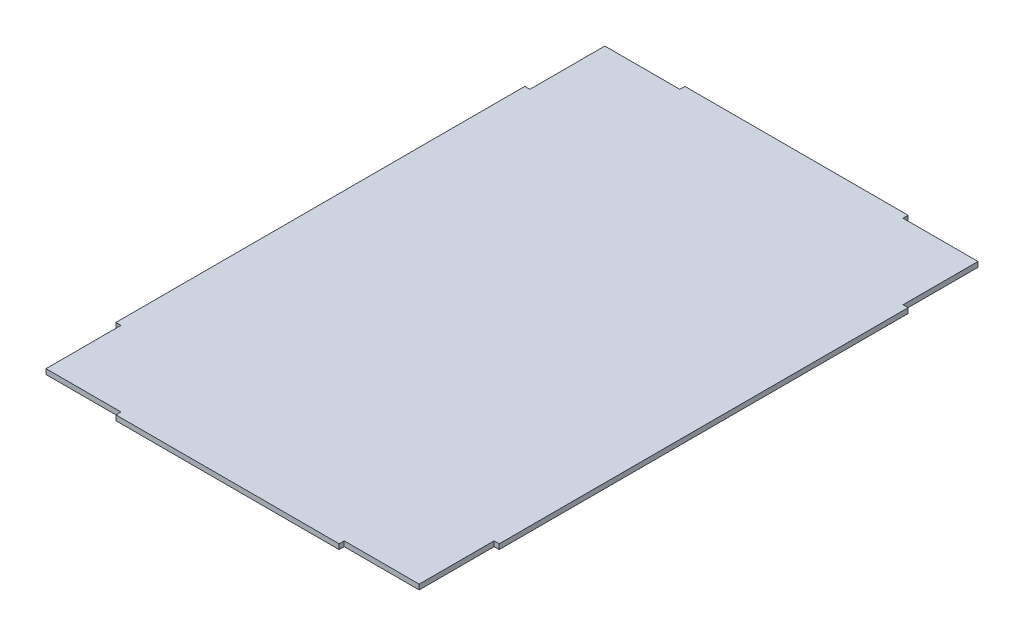
ISO-10303-21;
HEADER;
FILE_DESCRIPTION(('STEP AP214'),'2;1');
FILE_NAME('part.step','',(''),(''),'','','');
FILE_SCHEMA(('AUTOMOTIVE_DESIGN { 1 0 10303 214 1 1 1 1 }'));
ENDSEC;
DATA;
#1=APPLICATION_CONTEXT('core data for automotive mechanical design processes');
#2=APPLICATION_PROTOCOL_DEFINITION('international standard','automotive_design',2000,#1);
#3=PRODUCT_CONTEXT('',#1,'mechanical');
#4=PRODUCT('Part','Part','',(#3));
#5=PRODUCT_RELATED_PRODUCT_CATEGORY('part','',(#4));
#6=PRODUCT_DEFINITION_FORMATION('','',#4);
#7=PRODUCT_DEFINITION_CONTEXT('part definition',#1,'design');
#8=PRODUCT_DEFINITION('design','',#6,#7);
#9=PRODUCT_DEFINITION_SHAPE('','',#8);
#10=(LENGTH_UNIT() NAMED_UNIT(*) SI_UNIT(.MILLI.,.METRE.));
#11=(NAMED_UNIT(*) PLANE_ANGLE_UNIT() SI_UNIT($,.RADIAN.));
#12=(NAMED_UNIT(*) SI_UNIT($,.STERADIAN.) SOLID_ANGLE_UNIT());
#13=UNCERTAINTY_MEASURE_WITH_UNIT(LENGTH_MEASURE(1.E-05),#10,'distance_accuracy_value','');
#14=(GEOMETRIC_REPRESENTATION_CONTEXT(3) GLOBAL_UNCERTAINTY_ASSIGNED_CONTEXT((#13)) GLOBAL_UNIT_ASSIGNED_CONTEXT((#10,
#11,#12)) REPRESENTATION_CONTEXT('',''));
#15=CARTESIAN_POINT('',(0.,0.,0.));
#16=DIRECTION('',(0.,0.,1.));
#17=DIRECTION('',(1.,0.,0.));
#18=AXIS2_PLACEMENT_3D('',#15,#16,#17);
#19=CARTESIAN_POINT('',(239.5,3.175,355.5));
#20=DIRECTION('',(-1.,0.,0.));
#21=DIRECTION('',(0.,0.,1.));
#22=AXIS2_PLACEMENT_3D('',#19,#20,#21);
#23=PLANE('',#22);
#24=DIRECTION('',(0.,0.,-1.));
#25=VECTOR('',#24,1.);
#26=CARTESIAN_POINT('',(239.5,3.175,355.5));
#27=LINE('',#26,#25);
#28=CARTESIAN_POINT('',(239.5,3.175,255.5));
#29=VERTEX_POINT('',#28);
#30=CARTESIAN_POINT('',(239.5,3.175,-255.5));
#31=VERTEX_POINT('',#30);
#32=EDGE_CURVE('E225',#29,#31,#27,.T.);
#33=ORIENTED_EDGE('',*,*,#32,.F.);
#34=DIRECTION('',(0.,1.,0.));
#35=VECTOR('',#34,1.);
#36=CARTESIAN_POINT('',(239.5,-3.175,255.5));
#37=LINE('',#36,#35);
#38=CARTESIAN_POINT('',(239.5,-3.175,255.5));
#39=VERTEX_POINT('',#38);
#40=EDGE_CURVE('E317',#39,#29,#37,.T.);
#41=ORIENTED_EDGE('',*,*,#40,.F.);
#42=DIRECTION('',(0.,0.,-1.));
#43=VECTOR('',#42,1.);
#44=CARTESIAN_POINT('',(239.5,-3.175,355.5));
#45=LINE('',#44,#43);
#46=CARTESIAN_POINT('',(239.5,-3.175,-255.5));
#47=VERTEX_POINT('',#46);
#48=EDGE_CURVE('E211',#39,#47,#45,.T.);
#49=ORIENTED_EDGE('',*,*,#48,.T.);
#50=DIRECTION('',(0.,1.,0.));
#51=VECTOR('',#50,1.);
#52=CARTESIAN_POINT('',(239.5,-3.175,-255.5));
#53=LINE('',#52,#51);
#54=EDGE_CURVE('E259',#47,#31,#53,.T.);
#55=ORIENTED_EDGE('',*,*,#54,.T.);
#56=EDGE_LOOP('',(#33,#41,#49,#55));
#57=FACE_BOUND('',#56,.T.);
#58=ADVANCED_FACE('F39',(#57),#23,.F.);
#59=CARTESIAN_POINT('',(-239.5,3.175,-355.5));
#60=DIRECTION('',(0.,0.,1.));
#61=DIRECTION('',(1.,0.,0.));
#62=AXIS2_PLACEMENT_3D('',#59,#60,#61);
#63=PLANE('',#62);
#64=DIRECTION('',(-1.,0.,0.));
#65=VECTOR('',#64,1.);
#66=CARTESIAN_POINT('',(-239.5,3.175,-355.5));
#67=LINE('',#66,#65);
#68=CARTESIAN_POINT('',(139.5,3.175,-355.5));
#69=VERTEX_POINT('',#68);
#70=CARTESIAN_POINT('',(-139.5,3.175,-355.5));
#71=VERTEX_POINT('',#70);
#72=EDGE_CURVE('E199',#69,#71,#67,.T.);
#73=ORIENTED_EDGE('',*,*,#72,.F.);
#74=DIRECTION('',(0.,1.,0.));
#75=VECTOR('',#74,1.);
#76=CARTESIAN_POINT('',(139.5,-3.175,-355.5));
#77=LINE('',#76,#75);
#78=CARTESIAN_POINT('',(139.5,-3.175,-355.5));
#79=VERTEX_POINT('',#78);
#80=EDGE_CURVE('E182',#79,#69,#77,.T.);
#81=ORIENTED_EDGE('',*,*,#80,.F.);
#82=DIRECTION('',(-1.,0.,0.));
#83=VECTOR('',#82,1.);
#84=CARTESIAN_POINT('',(-239.5,-3.175,-355.5));
#85=LINE('',#84,#83);
#86=CARTESIAN_POINT('',(-139.5,-3.175,-355.5));
#87=VERTEX_POINT('',#86);
#88=EDGE_CURVE('E197',#79,#87,#85,.T.);
#89=ORIENTED_EDGE('',*,*,#88,.T.);
#90=DIRECTION('',(0.,1.,0.));
#91=VECTOR('',#90,1.);
#92=CARTESIAN_POINT('',(-139.5,-3.175,-355.5));
#93=LINE('',#92,#91);
#94=EDGE_CURVE('E217',#87,#71,#93,.T.);
#95=ORIENTED_EDGE('',*,*,#94,.T.);
#96=EDGE_LOOP('',(#73,#81,#89,#95));
#97=FACE_BOUND('',#96,.T.);
#98=ADVANCED_FACE('F195',(#97),#63,.F.);
#99=CARTESIAN_POINT('',(-239.5,3.175,355.5));
#100=DIRECTION('',(1.,0.,0.));
#101=DIRECTION('',(0.,0.,-1.));
#102=AXIS2_PLACEMENT_3D('',#99,#100,#101);
#103=PLANE('',#102);
#104=DIRECTION('',(0.,0.,1.));
#105=VECTOR('',#104,1.);
#106=CARTESIAN_POINT('',(-239.5,-3.175,355.5));
#107=LINE('',#106,#105);
#108=CARTESIAN_POINT('',(-239.5,-3.175,-255.5));
#109=VERTEX_POINT('',#108);
#110=CARTESIAN_POINT('',(-239.5,-3.175,255.5));
#111=VERTEX_POINT('',#110);
#112=EDGE_CURVE('E210',#109,#111,#107,.T.);
#113=ORIENTED_EDGE('',*,*,#112,.T.);
#114=DIRECTION('',(0.,1.,0.));
#115=VECTOR('',#114,1.);
#116=CARTESIAN_POINT('',(-239.5,-3.175,255.5));
#117=LINE('',#116,#115);
#118=CARTESIAN_POINT('',(-239.5,3.175,255.5));
#119=VERTEX_POINT('',#118);
#120=EDGE_CURVE('E285',#111,#119,#117,.T.);
#121=ORIENTED_EDGE('',*,*,#120,.T.);
#122=DIRECTION('',(0.,0.,1.));
#123=VECTOR('',#122,1.);
#124=CARTESIAN_POINT('',(-239.5,3.175,355.5));
#125=LINE('',#124,#123);
#126=CARTESIAN_POINT('',(-239.5,3.175,-255.5));
#127=VERTEX_POINT('',#126);
#128=EDGE_CURVE('E48',#127,#119,#125,.T.);
#129=ORIENTED_EDGE('',*,*,#128,.F.);
#130=DIRECTION('',(0.,1.,0.));
#131=VECTOR('',#130,1.);
#132=CARTESIAN_POINT('',(-239.5,-3.175,-255.5));
#133=LINE('',#132,#131);
#134=EDGE_CURVE('E229',#109,#127,#133,.T.);
#135=ORIENTED_EDGE('',*,*,#134,.F.);
#136=EDGE_LOOP('',(#113,#121,#129,#135));
#137=FACE_BOUND('',#136,.T.);
#138=ADVANCED_FACE('F445',(#137),#103,.F.);
#139=CARTESIAN_POINT('',(-239.5,3.175,355.5));
#140=DIRECTION('',(0.,0.,-1.));
#141=DIRECTION('',(-1.,0.,0.));
#142=AXIS2_PLACEMENT_3D('',#139,#140,#141);
#143=PLANE('',#142);
#144=DIRECTION('',(1.,0.,0.));
#145=VECTOR('',#144,1.);
#146=CARTESIAN_POINT('',(-239.5,3.175,355.5));
#147=LINE('',#146,#145);
#148=CARTESIAN_POINT('',(-139.5,3.175,355.5));
#149=VERTEX_POINT('',#148);
#150=CARTESIAN_POINT('',(139.5,3.175,355.5));
#151=VERTEX_POINT('',#150);
#152=EDGE_CURVE('E11',#149,#151,#147,.T.);
#153=ORIENTED_EDGE('',*,*,#152,.F.);
#154=DIRECTION('',(0.,1.,0.));
#155=VECTOR('',#154,1.);
#156=CARTESIAN_POINT('',(-139.5,-3.175,355.5));
#157=LINE('',#156,#155);
#158=CARTESIAN_POINT('',(-139.5,-3.175,355.5));
#159=VERTEX_POINT('',#158);
#160=EDGE_CURVE('E272',#159,#149,#157,.T.);
#161=ORIENTED_EDGE('',*,*,#160,.F.);
#162=DIRECTION('',(1.,0.,0.));
#163=VECTOR('',#162,1.);
#164=CARTESIAN_POINT('',(-239.5,-3.175,355.5));
#165=LINE('',#164,#163);
#166=CARTESIAN_POINT('',(139.5,-3.175,355.5));
#167=VERTEX_POINT('',#166);
#168=EDGE_CURVE('E42',#159,#167,#165,.T.);
#169=ORIENTED_EDGE('',*,*,#168,.T.);
#170=DIRECTION('',(0.,1.,0.));
#171=VECTOR('',#170,1.);
#172=CARTESIAN_POINT('',(139.5,-3.175,355.5));
#173=LINE('',#172,#171);
#174=EDGE_CURVE('E330',#167,#151,#173,.T.);
#175=ORIENTED_EDGE('',*,*,#174,.T.);
#176=EDGE_LOOP('',(#153,#161,#169,#175));
#177=FACE_BOUND('',#176,.T.);
#178=ADVANCED_FACE('F427',(#177),#143,.F.);
#179=CARTESIAN_POINT('',(0.,3.175,0.));
#180=DIRECTION('',(0.,-1.,0.));
#181=DIRECTION('',(0.,0.,-1.));
#182=AXIS2_PLACEMENT_3D('',#179,#180,#181);
#183=PLANE('',#182);
#184=ORIENTED_EDGE('',*,*,#128,.T.);
#185=DIRECTION('',(-1.,0.,0.));
#186=VECTOR('',#185,1.);
#187=CARTESIAN_POINT('',(-233.15,3.175,255.5));
#188=LINE('',#187,#186);
#189=CARTESIAN_POINT('',(-233.15,3.175,255.5));
#190=VERTEX_POINT('',#189);
#191=EDGE_CURVE('E290',#190,#119,#188,.T.);
#192=ORIENTED_EDGE('',*,*,#191,.F.);
#193=DIRECTION('',(0.,0.,-1.));
#194=VECTOR('',#193,1.);
#195=CARTESIAN_POINT('',(-233.15,3.175,349.15));
#196=LINE('',#195,#194);
#197=CARTESIAN_POINT('',(-233.15,3.175,349.15));
#198=VERTEX_POINT('',#197);
#199=EDGE_CURVE('E294',#198,#190,#196,.T.);
#200=ORIENTED_EDGE('',*,*,#199,.F.);
#201=DIRECTION('',(-1.,0.,0.));
#202=VECTOR('',#201,1.);
#203=CARTESIAN_POINT('',(-139.5,3.175,349.15));
#204=LINE('',#203,#202);
#205=CARTESIAN_POINT('',(-139.5,3.175,349.15));
#206=VERTEX_POINT('',#205);
#207=EDGE_CURVE('E298',#206,#198,#204,.T.);
#208=ORIENTED_EDGE('',*,*,#207,.F.);
#209=DIRECTION('',(0.,0.,-1.));
#210=VECTOR('',#209,1.);
#211=CARTESIAN_POINT('',(-139.5,3.175,355.5));
#212=LINE('',#211,#210);
#213=EDGE_CURVE('E302',#149,#206,#212,.T.);
#214=ORIENTED_EDGE('',*,*,#213,.F.);
#215=ORIENTED_EDGE('',*,*,#152,.T.);
#216=DIRECTION('',(0.,0.,1.));
#217=VECTOR('',#216,1.);
#218=CARTESIAN_POINT('',(139.5,3.175,349.15));
#219=LINE('',#218,#217);
#220=CARTESIAN_POINT('',(139.5,3.175,349.15));
#221=VERTEX_POINT('',#220);
#222=EDGE_CURVE('E335',#221,#151,#219,.T.);
#223=ORIENTED_EDGE('',*,*,#222,.F.);
#224=DIRECTION('',(-1.,0.,0.));
#225=VECTOR('',#224,1.);
#226=CARTESIAN_POINT('',(233.15,3.175,349.15));
#227=LINE('',#226,#225);
#228=CARTESIAN_POINT('',(233.15,3.175,349.15));
#229=VERTEX_POINT('',#228);
#230=EDGE_CURVE('E339',#229,#221,#227,.T.);
#231=ORIENTED_EDGE('',*,*,#230,.F.);
#232=DIRECTION('',(0.,0.,1.));
#233=VECTOR('',#232,1.);
#234=CARTESIAN_POINT('',(233.15,3.175,255.5));
#235=LINE('',#234,#233);
#236=CARTESIAN_POINT('',(233.15,3.175,255.5));
#237=VERTEX_POINT('',#236);
#238=EDGE_CURVE('E343',#237,#229,#235,.T.);
#239=ORIENTED_EDGE('',*,*,#238,.F.);
#240=DIRECTION('',(-1.,0.,0.));
#241=VECTOR('',#240,1.);
#242=CARTESIAN_POINT('',(239.5,3.175,255.5));
#243=LINE('',#242,#241);
#244=EDGE_CURVE('E289',#29,#237,#243,.T.);
#245=ORIENTED_EDGE('',*,*,#244,.F.);
#246=ORIENTED_EDGE('',*,*,#32,.T.);
#247=DIRECTION('',(1.,0.,0.));
#248=VECTOR('',#247,1.);
#249=CARTESIAN_POINT('',(233.15,3.175,-255.5));
#250=LINE('',#249,#248);
#251=CARTESIAN_POINT('',(233.15,3.175,-255.5));
#252=VERTEX_POINT('',#251);
#253=EDGE_CURVE('E190',#252,#31,#250,.T.);
#254=ORIENTED_EDGE('',*,*,#253,.F.);
#255=DIRECTION('',(0.,0.,1.));
#256=VECTOR('',#255,1.);
#257=CARTESIAN_POINT('',(233.15,3.175,-349.15));
#258=LINE('',#257,#256);
#259=CARTESIAN_POINT('',(233.15,3.175,-349.15));
#260=VERTEX_POINT('',#259);
#261=EDGE_CURVE('E375',#260,#252,#258,.T.);
#262=ORIENTED_EDGE('',*,*,#261,.F.);
#263=DIRECTION('',(1.,0.,0.));
#264=VECTOR('',#263,1.);
#265=CARTESIAN_POINT('',(139.5,3.175,-349.15));
#266=LINE('',#265,#264);
#267=CARTESIAN_POINT('',(139.5,3.175,-349.15));
#268=VERTEX_POINT('',#267);
#269=EDGE_CURVE('E379',#268,#260,#266,.T.);
#270=ORIENTED_EDGE('',*,*,#269,.F.);
#271=DIRECTION('',(0.,0.,1.));
#272=VECTOR('',#271,1.);
#273=CARTESIAN_POINT('',(139.5,3.175,-355.5));
#274=LINE('',#273,#272);
#275=EDGE_CURVE('E334',#69,#268,#274,.T.);
#276=ORIENTED_EDGE('',*,*,#275,.F.);
#277=ORIENTED_EDGE('',*,*,#72,.T.);
#278=DIRECTION('',(0.,0.,-1.));
#279=VECTOR('',#278,1.);
#280=CARTESIAN_POINT('',(-139.5,3.175,-349.15));
#281=LINE('',#280,#279);
#282=CARTESIAN_POINT('',(-139.5,3.175,-349.15));
#283=VERTEX_POINT('',#282);
#284=EDGE_CURVE('E243',#283,#71,#281,.T.);
#285=ORIENTED_EDGE('',*,*,#284,.F.);
#286=DIRECTION('',(1.,0.,0.));
#287=VECTOR('',#286,1.);
#288=CARTESIAN_POINT('',(-233.15,3.175,-349.15));
#289=LINE('',#288,#287);
#290=CARTESIAN_POINT('',(-233.15,3.175,-349.15));
#291=VERTEX_POINT('',#290);
#292=EDGE_CURVE('E247',#291,#283,#289,.T.);
#293=ORIENTED_EDGE('',*,*,#292,.F.);
#294=DIRECTION('',(0.,0.,-1.));
#295=VECTOR('',#294,1.);
#296=CARTESIAN_POINT('',(-233.15,3.175,-255.5));
#297=LINE('',#296,#295);
#298=CARTESIAN_POINT('',(-233.15,3.175,-255.5));
#299=VERTEX_POINT('',#298);
#300=EDGE_CURVE('E251',#299,#291,#297,.T.);
#301=ORIENTED_EDGE('',*,*,#300,.F.);
#302=DIRECTION('',(1.,0.,0.));
#303=VECTOR('',#302,1.);
#304=CARTESIAN_POINT('',(-239.5,3.175,-255.5));
#305=LINE('',#304,#303);
#306=EDGE_CURVE('E255',#127,#299,#305,.T.);
#307=ORIENTED_EDGE('',*,*,#306,.F.);
#308=EDGE_LOOP('',(#184,#192,#200,#208,#214,#215,#223,#231,#239,#245,#246,#254,#262,#270,#276,
#277,#285,#293,#301,#307));
#309=FACE_BOUND('',#308,.T.);
#310=ADVANCED_FACE('F413',(#309),#183,.F.);
#311=CARTESIAN_POINT('',(0.,-3.175,0.));
#312=DIRECTION('',(0.,-1.,0.));
#313=DIRECTION('',(0.,0.,-1.));
#314=AXIS2_PLACEMENT_3D('',#311,#312,#313);
#315=PLANE('',#314);
#316=DIRECTION('',(-1.,0.,0.));
#317=VECTOR('',#316,1.);
#318=CARTESIAN_POINT('',(-233.15,-3.175,255.5));
#319=LINE('',#318,#317);
#320=CARTESIAN_POINT('',(-233.15,-3.175,255.5));
#321=VERTEX_POINT('',#320);
#322=EDGE_CURVE('E276',#321,#111,#319,.T.);
#323=ORIENTED_EDGE('',*,*,#322,.T.);
#324=ORIENTED_EDGE('',*,*,#112,.F.);
#325=DIRECTION('',(1.,0.,0.));
#326=VECTOR('',#325,1.);
#327=CARTESIAN_POINT('',(-239.5,-3.175,-255.5));
#328=LINE('',#327,#326);
#329=CARTESIAN_POINT('',(-233.15,-3.175,-255.5));
#330=VERTEX_POINT('',#329);
#331=EDGE_CURVE('E246',#109,#330,#328,.T.);
#332=ORIENTED_EDGE('',*,*,#331,.T.);
#333=DIRECTION('',(0.,0.,-1.));
#334=VECTOR('',#333,1.);
#335=CARTESIAN_POINT('',(-233.15,-3.175,-255.5));
#336=LINE('',#335,#334);
#337=CARTESIAN_POINT('',(-233.15,-3.175,-349.15));
#338=VERTEX_POINT('',#337);
#339=EDGE_CURVE('E265',#330,#338,#336,.T.);
#340=ORIENTED_EDGE('',*,*,#339,.T.);
#341=DIRECTION('',(1.,0.,0.));
#342=VECTOR('',#341,1.);
#343=CARTESIAN_POINT('',(-233.15,-3.175,-349.15));
#344=LINE('',#343,#342);
#345=CARTESIAN_POINT('',(-139.5,-3.175,-349.15));
#346=VERTEX_POINT('',#345);
#347=EDGE_CURVE('E262',#338,#346,#344,.T.);
#348=ORIENTED_EDGE('',*,*,#347,.T.);
#349=DIRECTION('',(0.,0.,-1.));
#350=VECTOR('',#349,1.);
#351=CARTESIAN_POINT('',(-139.5,-3.175,-349.15));
#352=LINE('',#351,#350);
#353=EDGE_CURVE('E208',#346,#87,#352,.T.);
#354=ORIENTED_EDGE('',*,*,#353,.T.);
#355=ORIENTED_EDGE('',*,*,#88,.F.);
#356=DIRECTION('',(0.,0.,1.));
#357=VECTOR('',#356,1.);
#358=CARTESIAN_POINT('',(139.5,-3.175,-355.5));
#359=LINE('',#358,#357);
#360=CARTESIAN_POINT('',(139.5,-3.175,-349.15));
#361=VERTEX_POINT('',#360);
#362=EDGE_CURVE('E178',#79,#361,#359,.T.);
#363=ORIENTED_EDGE('',*,*,#362,.T.);
#364=DIRECTION('',(1.,0.,0.));
#365=VECTOR('',#364,1.);
#366=CARTESIAN_POINT('',(139.5,-3.175,-349.15));
#367=LINE('',#366,#365);
#368=CARTESIAN_POINT('',(233.15,-3.175,-349.15));
#369=VERTEX_POINT('',#368);
#370=EDGE_CURVE('E189',#361,#369,#367,.T.);
#371=ORIENTED_EDGE('',*,*,#370,.T.);
#372=DIRECTION('',(0.,0.,1.));
#373=VECTOR('',#372,1.);
#374=CARTESIAN_POINT('',(233.15,-3.175,-349.15));
#375=LINE('',#374,#373);
#376=CARTESIAN_POINT('',(233.15,-3.175,-255.5));
#377=VERTEX_POINT('',#376);
#378=EDGE_CURVE('E388',#369,#377,#375,.T.);
#379=ORIENTED_EDGE('',*,*,#378,.T.);
#380=DIRECTION('',(1.,0.,0.));
#381=VECTOR('',#380,1.);
#382=CARTESIAN_POINT('',(233.15,-3.175,-255.5));
#383=LINE('',#382,#381);
#384=EDGE_CURVE('E201',#377,#47,#383,.T.);
#385=ORIENTED_EDGE('',*,*,#384,.T.);
#386=ORIENTED_EDGE('',*,*,#48,.F.);
#387=DIRECTION('',(-1.,0.,0.));
#388=VECTOR('',#387,1.);
#389=CARTESIAN_POINT('',(239.5,-3.175,255.5));
#390=LINE('',#389,#388);
#391=CARTESIAN_POINT('',(233.15,-3.175,255.5));
#392=VERTEX_POINT('',#391);
#393=EDGE_CURVE('E338',#39,#392,#390,.T.);
#394=ORIENTED_EDGE('',*,*,#393,.T.);
#395=DIRECTION('',(0.,0.,1.));
#396=VECTOR('',#395,1.);
#397=CARTESIAN_POINT('',(233.15,-3.175,255.5));
#398=LINE('',#397,#396);
#399=CARTESIAN_POINT('',(233.15,-3.175,349.15));
#400=VERTEX_POINT('',#399);
#401=EDGE_CURVE('E64',#392,#400,#398,.T.);
#402=ORIENTED_EDGE('',*,*,#401,.T.);
#403=DIRECTION('',(-1.,0.,0.));
#404=VECTOR('',#403,1.);
#405=CARTESIAN_POINT('',(233.15,-3.175,349.15));
#406=LINE('',#405,#404);
#407=CARTESIAN_POINT('',(139.5,-3.175,349.15));
#408=VERTEX_POINT('',#407);
#409=EDGE_CURVE('E353',#400,#408,#406,.T.);
#410=ORIENTED_EDGE('',*,*,#409,.T.);
#411=DIRECTION('',(0.,0.,1.));
#412=VECTOR('',#411,1.);
#413=CARTESIAN_POINT('',(139.5,-3.175,349.15));
#414=LINE('',#413,#412);
#415=EDGE_CURVE('E321',#408,#167,#414,.T.);
#416=ORIENTED_EDGE('',*,*,#415,.T.);
#417=ORIENTED_EDGE('',*,*,#168,.F.);
#418=DIRECTION('',(0.,0.,-1.));
#419=VECTOR('',#418,1.);
#420=CARTESIAN_POINT('',(-139.5,-3.175,355.5));
#421=LINE('',#420,#419);
#422=CARTESIAN_POINT('',(-139.5,-3.175,349.15));
#423=VERTEX_POINT('',#422);
#424=EDGE_CURVE('E293',#159,#423,#421,.T.);
#425=ORIENTED_EDGE('',*,*,#424,.T.);
#426=DIRECTION('',(-1.,0.,0.));
#427=VECTOR('',#426,1.);
#428=CARTESIAN_POINT('',(-139.5,-3.175,349.15));
#429=LINE('',#428,#427);
#430=CARTESIAN_POINT('',(-233.15,-3.175,349.15));
#431=VERTEX_POINT('',#430);
#432=EDGE_CURVE('E56',#423,#431,#429,.T.);
#433=ORIENTED_EDGE('',*,*,#432,.T.);
#434=DIRECTION('',(0.,0.,-1.));
#435=VECTOR('',#434,1.);
#436=CARTESIAN_POINT('',(-233.15,-3.175,349.15));
#437=LINE('',#436,#435);
#438=EDGE_CURVE('E308',#431,#321,#437,.T.);
#439=ORIENTED_EDGE('',*,*,#438,.T.);
#440=EDGE_LOOP('',(#323,#324,#332,#340,#348,#354,#355,#363,#371,#379,#385,#386,#394,#402,#410,
#416,#417,#425,#433,#439));
#441=FACE_BOUND('',#440,.T.);
#442=ADVANCED_FACE('F205',(#441),#315,.T.);
#443=CARTESIAN_POINT('',(-139.5,-3.175,-349.15));
#444=DIRECTION('',(1.,0.,0.));
#445=DIRECTION('',(0.,0.,-1.));
#446=AXIS2_PLACEMENT_3D('',#443,#444,#445);
#447=PLANE('',#446);
#448=ORIENTED_EDGE('',*,*,#284,.T.);
#449=ORIENTED_EDGE('',*,*,#94,.F.);
#450=ORIENTED_EDGE('',*,*,#353,.F.);
#451=DIRECTION('',(0.,1.,0.));
#452=VECTOR('',#451,1.);
#453=CARTESIAN_POINT('',(-139.5,-3.175,-349.15));
#454=LINE('',#453,#452);
#455=EDGE_CURVE('E238',#346,#283,#454,.T.);
#456=ORIENTED_EDGE('',*,*,#455,.T.);
#457=EDGE_LOOP('',(#448,#449,#450,#456));
#458=FACE_BOUND('',#457,.T.);
#459=ADVANCED_FACE('F460',(#458),#447,.F.);
#460=CARTESIAN_POINT('',(-233.15,-3.175,-349.15));
#461=DIRECTION('',(0.,0.,1.));
#462=DIRECTION('',(1.,0.,0.));
#463=AXIS2_PLACEMENT_3D('',#460,#461,#462);
#464=PLANE('',#463);
#465=ORIENTED_EDGE('',*,*,#292,.T.);
#466=ORIENTED_EDGE('',*,*,#455,.F.);
#467=ORIENTED_EDGE('',*,*,#347,.F.);
#468=DIRECTION('',(0.,1.,0.));
#469=VECTOR('',#468,1.);
#470=CARTESIAN_POINT('',(-233.15,-3.175,-349.15));
#471=LINE('',#470,#469);
#472=EDGE_CURVE('E235',#338,#291,#471,.T.);
#473=ORIENTED_EDGE('',*,*,#472,.T.);
#474=EDGE_LOOP('',(#465,#466,#467,#473));
#475=FACE_BOUND('',#474,.T.);
#476=ADVANCED_FACE('F457',(#475),#464,.F.);
#477=CARTESIAN_POINT('',(-233.15,-3.175,-255.5));
#478=DIRECTION('',(1.,0.,0.));
#479=DIRECTION('',(0.,0.,-1.));
#480=AXIS2_PLACEMENT_3D('',#477,#478,#479);
#481=PLANE('',#480);
#482=ORIENTED_EDGE('',*,*,#300,.T.);
#483=ORIENTED_EDGE('',*,*,#472,.F.);
#484=ORIENTED_EDGE('',*,*,#339,.F.);
#485=DIRECTION('',(0.,1.,0.));
#486=VECTOR('',#485,1.);
#487=CARTESIAN_POINT('',(-233.15,-3.175,-255.5));
#488=LINE('',#487,#486);
#489=EDGE_CURVE('E232',#330,#299,#488,.T.);
#490=ORIENTED_EDGE('',*,*,#489,.T.);
#491=EDGE_LOOP('',(#482,#483,#484,#490));
#492=FACE_BOUND('',#491,.T.);
#493=ADVANCED_FACE('F455',(#492),#481,.F.);
#494=CARTESIAN_POINT('',(-239.5,-3.175,-255.5));
#495=DIRECTION('',(0.,0.,1.));
#496=DIRECTION('',(1.,0.,0.));
#497=AXIS2_PLACEMENT_3D('',#494,#495,#496);
#498=PLANE('',#497);
#499=ORIENTED_EDGE('',*,*,#306,.T.);
#500=ORIENTED_EDGE('',*,*,#489,.F.);
#501=ORIENTED_EDGE('',*,*,#331,.F.);
#502=ORIENTED_EDGE('',*,*,#134,.T.);
#503=EDGE_LOOP('',(#499,#500,#501,#502));
#504=FACE_BOUND('',#503,.T.);
#505=ADVANCED_FACE('F452',(#504),#498,.F.);
#506=CARTESIAN_POINT('',(233.15,-3.175,-255.5));
#507=DIRECTION('',(0.,0.,1.));
#508=DIRECTION('',(1.,0.,0.));
#509=AXIS2_PLACEMENT_3D('',#506,#507,#508);
#510=PLANE('',#509);
#511=ORIENTED_EDGE('',*,*,#253,.T.);
#512=ORIENTED_EDGE('',*,*,#54,.F.);
#513=ORIENTED_EDGE('',*,*,#384,.F.);
#514=DIRECTION('',(0.,1.,0.));
#515=VECTOR('',#514,1.);
#516=CARTESIAN_POINT('',(233.15,-3.175,-255.5));
#517=LINE('',#516,#515);
#518=EDGE_CURVE('E367',#377,#252,#517,.T.);
#519=ORIENTED_EDGE('',*,*,#518,.T.);
#520=EDGE_LOOP('',(#511,#512,#513,#519));
#521=FACE_BOUND('',#520,.T.);
#522=ADVANCED_FACE('F403',(#521),#510,.F.);
#523=CARTESIAN_POINT('',(233.15,-3.175,-349.15));
#524=DIRECTION('',(-1.,0.,0.));
#525=DIRECTION('',(0.,0.,1.));
#526=AXIS2_PLACEMENT_3D('',#523,#524,#525);
#527=PLANE('',#526);
#528=ORIENTED_EDGE('',*,*,#261,.T.);
#529=ORIENTED_EDGE('',*,*,#518,.F.);
#530=ORIENTED_EDGE('',*,*,#378,.F.);
#531=DIRECTION('',(0.,1.,0.));
#532=VECTOR('',#531,1.);
#533=CARTESIAN_POINT('',(233.15,-3.175,-349.15));
#534=LINE('',#533,#532);
#535=EDGE_CURVE('E364',#369,#260,#534,.T.);
#536=ORIENTED_EDGE('',*,*,#535,.T.);
#537=EDGE_LOOP('',(#528,#529,#530,#536));
#538=FACE_BOUND('',#537,.T.);
#539=ADVANCED_FACE('F399',(#538),#527,.F.);
#540=CARTESIAN_POINT('',(139.5,-3.175,-349.15));
#541=DIRECTION('',(0.,0.,1.));
#542=DIRECTION('',(1.,0.,0.));
#543=AXIS2_PLACEMENT_3D('',#540,#541,#542);
#544=PLANE('',#543);
#545=ORIENTED_EDGE('',*,*,#269,.T.);
#546=ORIENTED_EDGE('',*,*,#535,.F.);
#547=ORIENTED_EDGE('',*,*,#370,.F.);
#548=DIRECTION('',(0.,1.,0.));
#549=VECTOR('',#548,1.);
#550=CARTESIAN_POINT('',(139.5,-3.175,-349.15));
#551=LINE('',#550,#549);
#552=EDGE_CURVE('E184',#361,#268,#551,.T.);
#553=ORIENTED_EDGE('',*,*,#552,.T.);
#554=EDGE_LOOP('',(#545,#546,#547,#553));
#555=FACE_BOUND('',#554,.T.);
#556=ADVANCED_FACE('F395',(#555),#544,.F.);
#557=CARTESIAN_POINT('',(139.5,-3.175,-355.5));
#558=DIRECTION('',(-1.,0.,0.));
#559=DIRECTION('',(0.,0.,1.));
#560=AXIS2_PLACEMENT_3D('',#557,#558,#559);
#561=PLANE('',#560);
#562=ORIENTED_EDGE('',*,*,#275,.T.);
#563=ORIENTED_EDGE('',*,*,#552,.F.);
#564=ORIENTED_EDGE('',*,*,#362,.F.);
#565=ORIENTED_EDGE('',*,*,#80,.T.);
#566=EDGE_LOOP('',(#562,#563,#564,#565));
#567=FACE_BOUND('',#566,.T.);
#568=ADVANCED_FACE('F181',(#567),#561,.F.);
#569=CARTESIAN_POINT('',(139.5,-3.175,349.15));
#570=DIRECTION('',(-1.,0.,0.));
#571=DIRECTION('',(0.,0.,1.));
#572=AXIS2_PLACEMENT_3D('',#569,#570,#571);
#573=PLANE('',#572);
#574=ORIENTED_EDGE('',*,*,#222,.T.);
#575=ORIENTED_EDGE('',*,*,#174,.F.);
#576=ORIENTED_EDGE('',*,*,#415,.F.);
#577=DIRECTION('',(0.,1.,0.));
#578=VECTOR('',#577,1.);
#579=CARTESIAN_POINT('',(139.5,-3.175,349.15));
#580=LINE('',#579,#578);
#581=EDGE_CURVE('E327',#408,#221,#580,.T.);
#582=ORIENTED_EDGE('',*,*,#581,.T.);
#583=EDGE_LOOP('',(#574,#575,#576,#582));
#584=FACE_BOUND('',#583,.T.);
#585=ADVANCED_FACE('F424',(#584),#573,.F.);
#586=CARTESIAN_POINT('',(233.15,-3.175,349.15));
#587=DIRECTION('',(0.,0.,-1.));
#588=DIRECTION('',(-1.,0.,0.));
#589=AXIS2_PLACEMENT_3D('',#586,#587,#588);
#590=PLANE('',#589);
#591=ORIENTED_EDGE('',*,*,#230,.T.);
#592=ORIENTED_EDGE('',*,*,#581,.F.);
#593=ORIENTED_EDGE('',*,*,#409,.F.);
#594=DIRECTION('',(0.,1.,0.));
#595=VECTOR('',#594,1.);
#596=CARTESIAN_POINT('',(233.15,-3.175,349.15));
#597=LINE('',#596,#595);
#598=EDGE_CURVE('E324',#400,#229,#597,.T.);
#599=ORIENTED_EDGE('',*,*,#598,.T.);
#600=EDGE_LOOP('',(#591,#592,#593,#599));
#601=FACE_BOUND('',#600,.T.);
#602=ADVANCED_FACE('F422',(#601),#590,.F.);
#603=CARTESIAN_POINT('',(233.15,-3.175,255.5));
#604=DIRECTION('',(-1.,0.,0.));
#605=DIRECTION('',(0.,0.,1.));
#606=AXIS2_PLACEMENT_3D('',#603,#604,#605);
#607=PLANE('',#606);
#608=ORIENTED_EDGE('',*,*,#238,.T.);
#609=ORIENTED_EDGE('',*,*,#598,.F.);
#610=ORIENTED_EDGE('',*,*,#401,.F.);
#611=DIRECTION('',(0.,1.,0.));
#612=VECTOR('',#611,1.);
#613=CARTESIAN_POINT('',(233.15,-3.175,255.5));
#614=LINE('',#613,#612);
#615=EDGE_CURVE('E320',#392,#237,#614,.T.);
#616=ORIENTED_EDGE('',*,*,#615,.T.);
#617=EDGE_LOOP('',(#608,#609,#610,#616));
#618=FACE_BOUND('',#617,.T.);
#619=ADVANCED_FACE('F416',(#618),#607,.F.);
#620=CARTESIAN_POINT('',(239.5,-3.175,255.5));
#621=DIRECTION('',(0.,0.,-1.));
#622=DIRECTION('',(-1.,0.,0.));
#623=AXIS2_PLACEMENT_3D('',#620,#621,#622);
#624=PLANE('',#623);
#625=ORIENTED_EDGE('',*,*,#244,.T.);
#626=ORIENTED_EDGE('',*,*,#615,.F.);
#627=ORIENTED_EDGE('',*,*,#393,.F.);
#628=ORIENTED_EDGE('',*,*,#40,.T.);
#629=EDGE_LOOP('',(#625,#626,#627,#628));
#630=FACE_BOUND('',#629,.T.);
#631=ADVANCED_FACE('F410',(#630),#624,.F.);
#632=CARTESIAN_POINT('',(-233.15,-3.175,255.5));
#633=DIRECTION('',(0.,0.,-1.));
#634=DIRECTION('',(-1.,0.,0.));
#635=AXIS2_PLACEMENT_3D('',#632,#633,#634);
#636=PLANE('',#635);
#637=ORIENTED_EDGE('',*,*,#191,.T.);
#638=ORIENTED_EDGE('',*,*,#120,.F.);
#639=ORIENTED_EDGE('',*,*,#322,.F.);
#640=DIRECTION('',(0.,1.,0.));
#641=VECTOR('',#640,1.);
#642=CARTESIAN_POINT('',(-233.15,-3.175,255.5));
#643=LINE('',#642,#641);
#644=EDGE_CURVE('E282',#321,#190,#643,.T.);
#645=ORIENTED_EDGE('',*,*,#644,.T.);
#646=EDGE_LOOP('',(#637,#638,#639,#645));
#647=FACE_BOUND('',#646,.T.);
#648=ADVANCED_FACE('F442',(#647),#636,.F.);
#649=CARTESIAN_POINT('',(-233.15,-3.175,349.15));
#650=DIRECTION('',(1.,0.,0.));
#651=DIRECTION('',(0.,0.,-1.));
#652=AXIS2_PLACEMENT_3D('',#649,#650,#651);
#653=PLANE('',#652);
#654=ORIENTED_EDGE('',*,*,#199,.T.);
#655=ORIENTED_EDGE('',*,*,#644,.F.);
#656=ORIENTED_EDGE('',*,*,#438,.F.);
#657=DIRECTION('',(0.,1.,0.));
#658=VECTOR('',#657,1.);
#659=CARTESIAN_POINT('',(-233.15,-3.175,349.15));
#660=LINE('',#659,#658);
#661=EDGE_CURVE('E279',#431,#198,#660,.T.);
#662=ORIENTED_EDGE('',*,*,#661,.T.);
#663=EDGE_LOOP('',(#654,#655,#656,#662));
#664=FACE_BOUND('',#663,.T.);
#665=ADVANCED_FACE('F439',(#664),#653,.F.);
#666=CARTESIAN_POINT('',(-139.5,-3.175,349.15));
#667=DIRECTION('',(0.,0.,-1.));
#668=DIRECTION('',(-1.,0.,0.));
#669=AXIS2_PLACEMENT_3D('',#666,#667,#668);
#670=PLANE('',#669);
#671=ORIENTED_EDGE('',*,*,#207,.T.);
#672=ORIENTED_EDGE('',*,*,#661,.F.);
#673=ORIENTED_EDGE('',*,*,#432,.F.);
#674=DIRECTION('',(0.,1.,0.));
#675=VECTOR('',#674,1.);
#676=CARTESIAN_POINT('',(-139.5,-3.175,349.15));
#677=LINE('',#676,#675);
#678=EDGE_CURVE('E275',#423,#206,#677,.T.);
#679=ORIENTED_EDGE('',*,*,#678,.T.);
#680=EDGE_LOOP('',(#671,#672,#673,#679));
#681=FACE_BOUND('',#680,.T.);
#682=ADVANCED_FACE('F554',(#681),#670,.F.);
#683=CARTESIAN_POINT('',(-139.5,-3.175,355.5));
#684=DIRECTION('',(1.,0.,0.));
#685=DIRECTION('',(0.,0.,-1.));
#686=AXIS2_PLACEMENT_3D('',#683,#684,#685);
#687=PLANE('',#686);
#688=ORIENTED_EDGE('',*,*,#213,.T.);
#689=ORIENTED_EDGE('',*,*,#678,.F.);
#690=ORIENTED_EDGE('',*,*,#424,.F.);
#691=ORIENTED_EDGE('',*,*,#160,.T.);
#692=EDGE_LOOP('',(#688,#689,#690,#691));
#693=FACE_BOUND('',#692,.T.);
#694=ADVANCED_FACE('F433',(#693),#687,.F.);
#695=CLOSED_SHELL('',(#58,#98,#138,#178,#310,#442,#459,#476,#493,#505,#522,#539,#556,#568,#585,
#602,#619,#631,#648,#665,#682,#694));
#696=MANIFOLD_SOLID_BREP('B2',#695);
#697=ADVANCED_BREP_SHAPE_REPRESENTATION('',(#18,#696),#14);
#698=SHAPE_DEFINITION_REPRESENTATION(#9,#697);
ENDSEC;
END-ISO-10303-21;
